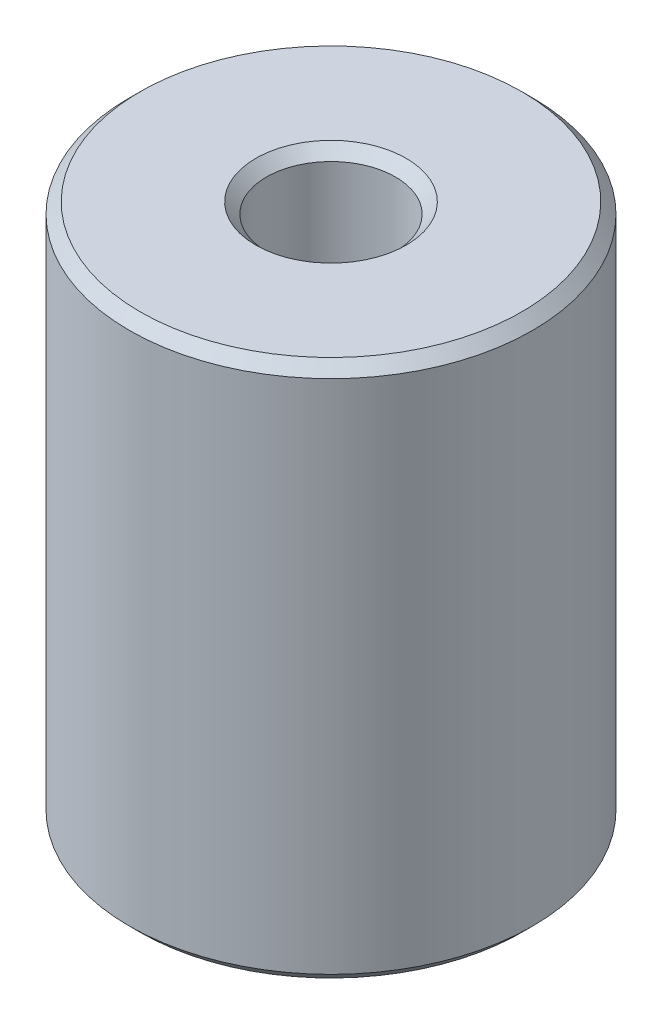
ISO-10303-21;
HEADER;
FILE_DESCRIPTION(('STEP AP214'),'2;1');
FILE_NAME('part.step','',(''),(''),'','','');
FILE_SCHEMA(('AUTOMOTIVE_DESIGN { 1 0 10303 214 1 1 1 1 }'));
ENDSEC;
DATA;
#1=APPLICATION_CONTEXT('core data for automotive mechanical design processes');
#2=APPLICATION_PROTOCOL_DEFINITION('international standard','automotive_design',2000,#1);
#3=PRODUCT_CONTEXT('',#1,'mechanical');
#4=PRODUCT('Part','Part','',(#3));
#5=PRODUCT_RELATED_PRODUCT_CATEGORY('part','',(#4));
#6=PRODUCT_DEFINITION_FORMATION('','',#4);
#7=PRODUCT_DEFINITION_CONTEXT('part definition',#1,'design');
#8=PRODUCT_DEFINITION('design','',#6,#7);
#9=PRODUCT_DEFINITION_SHAPE('','',#8);
#10=(LENGTH_UNIT() NAMED_UNIT(*) SI_UNIT(.MILLI.,.METRE.));
#11=(NAMED_UNIT(*) PLANE_ANGLE_UNIT() SI_UNIT($,.RADIAN.));
#12=(NAMED_UNIT(*) SI_UNIT($,.STERADIAN.) SOLID_ANGLE_UNIT());
#13=UNCERTAINTY_MEASURE_WITH_UNIT(LENGTH_MEASURE(1.E-05),#10,'distance_accuracy_value','');
#14=(GEOMETRIC_REPRESENTATION_CONTEXT(3) GLOBAL_UNCERTAINTY_ASSIGNED_CONTEXT((#13)) GLOBAL_UNIT_ASSIGNED_CONTEXT((#10,
#11,#12)) REPRESENTATION_CONTEXT('',''));
#15=CARTESIAN_POINT('',(0.,0.,0.));
#16=DIRECTION('',(0.,0.,1.));
#17=DIRECTION('',(1.,0.,0.));
#18=AXIS2_PLACEMENT_3D('',#15,#16,#17);
#19=CARTESIAN_POINT('',(0.,12.7,0.));
#20=DIRECTION('',(0.,1.,0.));
#21=DIRECTION('',(0.,0.,1.));
#22=AXIS2_PLACEMENT_3D('',#19,#20,#21);
#23=PLANE('',#22);
#24=CARTESIAN_POINT('',(0.,12.7,0.));
#25=DIRECTION('',(0.,1.,0.));
#26=DIRECTION('',(0.,0.,1.));
#27=AXIS2_PLACEMENT_3D('',#24,#25,#26);
#28=CIRCLE('',#27,1.77800000000001);
#29=CARTESIAN_POINT('',(0.,12.7,1.77800000000001));
#30=VERTEX_POINT('',#29);
#31=EDGE_CURVE('E50',#30,#30,#28,.F.);
#32=ORIENTED_EDGE('',*,*,#31,.T.);
#33=EDGE_LOOP('',(#32));
#34=FACE_BOUND('',#33,.T.);
#35=CARTESIAN_POINT('',(0.,12.7,0.));
#36=DIRECTION('',(0.,1.,0.));
#37=DIRECTION('',(0.,0.,1.));
#38=AXIS2_PLACEMENT_3D('',#35,#36,#37);
#39=CIRCLE('',#38,4.5085);
#40=CARTESIAN_POINT('',(0.,12.7,4.5085));
#41=VERTEX_POINT('',#40);
#42=EDGE_CURVE('E53',#41,#41,#39,.T.);
#43=ORIENTED_EDGE('',*,*,#42,.T.);
#44=EDGE_LOOP('',(#43));
#45=FACE_BOUND('',#44,.T.);
#46=ADVANCED_FACE('F30',(#34,#45),#23,.T.);
#47=CARTESIAN_POINT('',(0.,0.,0.));
#48=DIRECTION('',(0.,1.,0.));
#49=DIRECTION('',(0.,0.,1.));
#50=AXIS2_PLACEMENT_3D('',#47,#48,#49);
#51=PLANE('',#50);
#52=CARTESIAN_POINT('',(0.,0.,0.));
#53=DIRECTION('',(0.,1.,0.));
#54=DIRECTION('',(0.,0.,1.));
#55=AXIS2_PLACEMENT_3D('',#52,#53,#54);
#56=CIRCLE('',#55,1.778);
#57=CARTESIAN_POINT('',(0.,0.,1.778));
#58=VERTEX_POINT('',#57);
#59=EDGE_CURVE('E10',#58,#58,#56,.T.);
#60=ORIENTED_EDGE('',*,*,#59,.T.);
#61=EDGE_LOOP('',(#60));
#62=FACE_BOUND('',#61,.T.);
#63=CARTESIAN_POINT('',(0.,0.,0.));
#64=DIRECTION('',(0.,1.,0.));
#65=DIRECTION('',(0.,0.,1.));
#66=AXIS2_PLACEMENT_3D('',#63,#64,#65);
#67=CIRCLE('',#66,4.5085);
#68=CARTESIAN_POINT('',(0.,0.,4.5085));
#69=VERTEX_POINT('',#68);
#70=EDGE_CURVE('E37',#69,#69,#67,.F.);
#71=ORIENTED_EDGE('',*,*,#70,.T.);
#72=EDGE_LOOP('',(#71));
#73=FACE_BOUND('',#72,.T.);
#74=ADVANCED_FACE('F78',(#62,#73),#51,.F.);
#75=CARTESIAN_POINT('',(0.,12.7,0.));
#76=DIRECTION('',(0.,-1.,0.));
#77=DIRECTION('',(0.,0.,-1.));
#78=AXIS2_PLACEMENT_3D('',#75,#76,#77);
#79=CYLINDRICAL_SURFACE('',#78,4.7625);
#80=CARTESIAN_POINT('',(0.,12.446,0.));
#81=DIRECTION('',(0.,1.,0.));
#82=DIRECTION('',(0.,0.,1.));
#83=AXIS2_PLACEMENT_3D('',#80,#81,#82);
#84=CIRCLE('',#83,4.7625);
#85=CARTESIAN_POINT('',(0.,12.446,4.7625));
#86=VERTEX_POINT('',#85);
#87=EDGE_CURVE('E41',#86,#86,#84,.F.);
#88=ORIENTED_EDGE('',*,*,#87,.T.);
#89=EDGE_LOOP('',(#88));
#90=FACE_BOUND('',#89,.T.);
#91=CARTESIAN_POINT('',(0.,0.254000000000004,0.));
#92=DIRECTION('',(0.,1.,0.));
#93=DIRECTION('',(0.,0.,1.));
#94=AXIS2_PLACEMENT_3D('',#91,#92,#93);
#95=CIRCLE('',#94,4.7625);
#96=CARTESIAN_POINT('',(0.,0.254000000000004,4.7625));
#97=VERTEX_POINT('',#96);
#98=EDGE_CURVE('E45',#97,#97,#95,.T.);
#99=ORIENTED_EDGE('',*,*,#98,.T.);
#100=EDGE_LOOP('',(#99));
#101=FACE_BOUND('',#100,.T.);
#102=ADVANCED_FACE('F84',(#90,#101),#79,.T.);
#103=CARTESIAN_POINT('',(0.,12.7,0.));
#104=DIRECTION('',(0.,-1.,0.));
#105=DIRECTION('',(0.,0.,-1.));
#106=AXIS2_PLACEMENT_3D('',#103,#104,#105);
#107=CYLINDRICAL_SURFACE('',#106,1.524);
#108=CARTESIAN_POINT('',(0.,12.446,0.));
#109=DIRECTION('',(0.,1.,0.));
#110=DIRECTION('',(0.,0.,1.));
#111=AXIS2_PLACEMENT_3D('',#108,#109,#110);
#112=CIRCLE('',#111,1.524);
#113=CARTESIAN_POINT('',(0.,12.446,1.524));
#114=VERTEX_POINT('',#113);
#115=EDGE_CURVE('E56',#114,#114,#112,.T.);
#116=ORIENTED_EDGE('',*,*,#115,.T.);
#117=EDGE_LOOP('',(#116));
#118=FACE_BOUND('',#117,.T.);
#119=CARTESIAN_POINT('',(0.,0.253999999999999,0.));
#120=DIRECTION('',(0.,1.,0.));
#121=DIRECTION('',(0.,0.,1.));
#122=AXIS2_PLACEMENT_3D('',#119,#120,#121);
#123=CIRCLE('',#122,1.524);
#124=CARTESIAN_POINT('',(0.,0.253999999999999,1.524));
#125=VERTEX_POINT('',#124);
#126=EDGE_CURVE('E59',#125,#125,#123,.F.);
#127=ORIENTED_EDGE('',*,*,#126,.T.);
#128=EDGE_LOOP('',(#127));
#129=FACE_BOUND('',#128,.T.);
#130=ADVANCED_FACE('F63',(#118,#129),#107,.F.);
#131=CARTESIAN_POINT('',(0.,12.446,0.));
#132=DIRECTION('',(0.,1.,0.));
#133=DIRECTION('',(0.,0.,1.));
#134=AXIS2_PLACEMENT_3D('',#131,#132,#133);
#135=CONICAL_SURFACE('',#134,1.524,0.785398163397455);
#136=ORIENTED_EDGE('',*,*,#31,.F.);
#137=EDGE_LOOP('',(#136));
#138=FACE_BOUND('',#137,.T.);
#139=ORIENTED_EDGE('',*,*,#115,.F.);
#140=EDGE_LOOP('',(#139));
#141=FACE_BOUND('',#140,.T.);
#142=ADVANCED_FACE('F74',(#138,#141),#135,.F.);
#143=CARTESIAN_POINT('',(0.,12.7,0.));
#144=DIRECTION('',(0.,-1.,0.));
#145=DIRECTION('',(0.,0.,-1.));
#146=AXIS2_PLACEMENT_3D('',#143,#144,#145);
#147=CONICAL_SURFACE('',#146,4.5085,0.785398163397452);
#148=ORIENTED_EDGE('',*,*,#87,.F.);
#149=EDGE_LOOP('',(#148));
#150=FACE_BOUND('',#149,.T.);
#151=ORIENTED_EDGE('',*,*,#42,.F.);
#152=EDGE_LOOP('',(#151));
#153=FACE_BOUND('',#152,.T.);
#154=ADVANCED_FACE('F68',(#150,#153),#147,.T.);
#155=CARTESIAN_POINT('',(0.,0.,0.));
#156=DIRECTION('',(0.,-1.,0.));
#157=DIRECTION('',(0.,0.,-1.));
#158=AXIS2_PLACEMENT_3D('',#155,#156,#157);
#159=CONICAL_SURFACE('',#158,1.778,0.785398163397448);
#160=ORIENTED_EDGE('',*,*,#126,.F.);
#161=EDGE_LOOP('',(#160));
#162=FACE_BOUND('',#161,.T.);
#163=ORIENTED_EDGE('',*,*,#59,.F.);
#164=EDGE_LOOP('',(#163));
#165=FACE_BOUND('',#164,.T.);
#166=ADVANCED_FACE('F65',(#162,#165),#159,.F.);
#167=CARTESIAN_POINT('',(0.,0.254000000000004,0.));
#168=DIRECTION('',(0.,1.,0.));
#169=DIRECTION('',(0.,0.,1.));
#170=AXIS2_PLACEMENT_3D('',#167,#168,#169);
#171=CONICAL_SURFACE('',#170,4.7625,0.785398163397448);
#172=ORIENTED_EDGE('',*,*,#70,.F.);
#173=EDGE_LOOP('',(#172));
#174=FACE_BOUND('',#173,.T.);
#175=ORIENTED_EDGE('',*,*,#98,.F.);
#176=EDGE_LOOP('',(#175));
#177=FACE_BOUND('',#176,.T.);
#178=ADVANCED_FACE('F32',(#174,#177),#171,.T.);
#179=CLOSED_SHELL('',(#46,#74,#102,#130,#142,#154,#166,#178));
#180=MANIFOLD_SOLID_BREP('B2',#179);
#181=ADVANCED_BREP_SHAPE_REPRESENTATION('',(#18,#180),#14);
#182=SHAPE_DEFINITION_REPRESENTATION(#9,#181);
ENDSEC;
END-ISO-10303-21;
